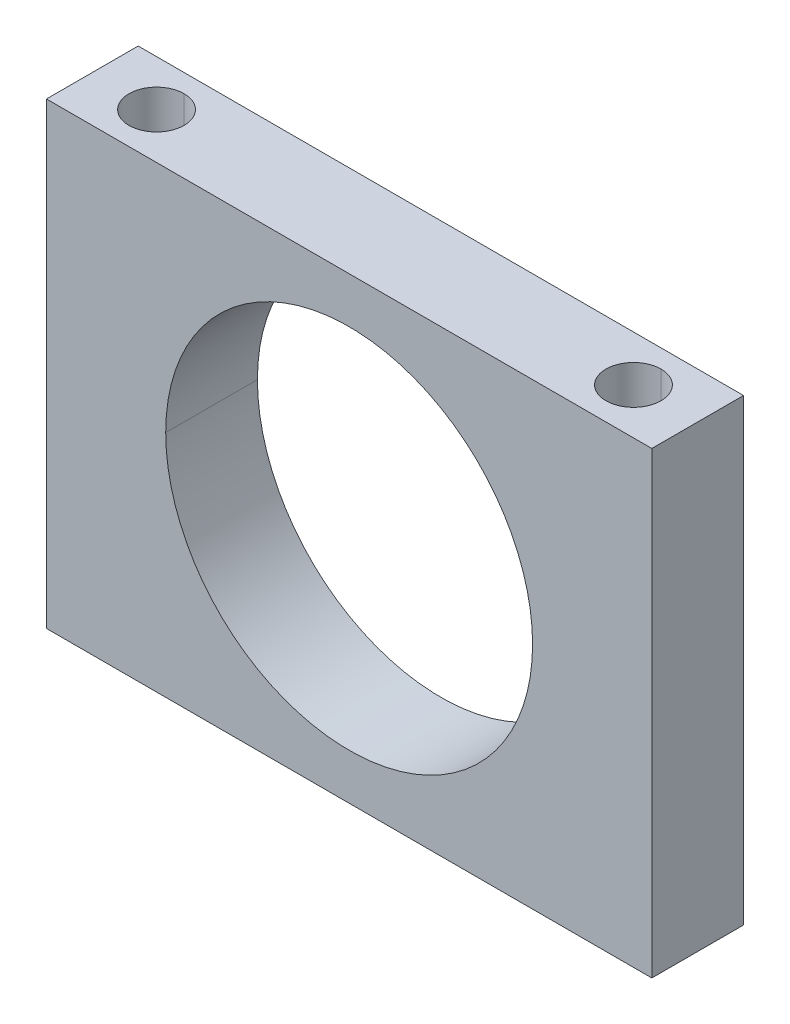
ISO-10303-21;
HEADER;
FILE_DESCRIPTION(('STEP AP214'),'2;1');
FILE_NAME('part.step','',(''),(''),'','','');
FILE_SCHEMA(('AUTOMOTIVE_DESIGN { 1 0 10303 214 1 1 1 1 }'));
ENDSEC;
DATA;
#1=APPLICATION_CONTEXT('core data for automotive mechanical design processes');
#2=APPLICATION_PROTOCOL_DEFINITION('international standard','automotive_design',2000,#1);
#3=PRODUCT_CONTEXT('',#1,'mechanical');
#4=PRODUCT('Part','Part','',(#3));
#5=PRODUCT_RELATED_PRODUCT_CATEGORY('part','',(#4));
#6=PRODUCT_DEFINITION_FORMATION('','',#4);
#7=PRODUCT_DEFINITION_CONTEXT('part definition',#1,'design');
#8=PRODUCT_DEFINITION('design','',#6,#7);
#9=PRODUCT_DEFINITION_SHAPE('','',#8);
#10=(LENGTH_UNIT() NAMED_UNIT(*) SI_UNIT(.MILLI.,.METRE.));
#11=(NAMED_UNIT(*) PLANE_ANGLE_UNIT() SI_UNIT($,.RADIAN.));
#12=(NAMED_UNIT(*) SI_UNIT($,.STERADIAN.) SOLID_ANGLE_UNIT());
#13=UNCERTAINTY_MEASURE_WITH_UNIT(LENGTH_MEASURE(1.E-05),#10,'distance_accuracy_value','');
#14=(GEOMETRIC_REPRESENTATION_CONTEXT(3) GLOBAL_UNCERTAINTY_ASSIGNED_CONTEXT((#13)) GLOBAL_UNIT_ASSIGNED_CONTEXT((#10,
#11,#12)) REPRESENTATION_CONTEXT('',''));
#15=CARTESIAN_POINT('',(0.,0.,0.));
#16=DIRECTION('',(0.,0.,1.));
#17=DIRECTION('',(1.,0.,0.));
#18=AXIS2_PLACEMENT_3D('',#15,#16,#17);
#19=CARTESIAN_POINT('',(-21.1436053074788,0.615283078611133,2.5));
#20=DIRECTION('',(0.,1.,0.));
#21=DIRECTION('',(0.,0.,1.));
#22=AXIS2_PLACEMENT_3D('',#19,#20,#21);
#23=CYLINDRICAL_SURFACE('',#22,1.5);
#24=DIRECTION('',(0.,1.,0.));
#25=VECTOR('',#24,1.);
#26=CARTESIAN_POINT('',(-21.1436053074788,0.615283078611133,1.));
#27=LINE('',#26,#25);
#28=CARTESIAN_POINT('',(-21.1436053074788,0.615283078611133,1.));
#29=VERTEX_POINT('',#28);
#30=CARTESIAN_POINT('',(-21.1436053074788,25.6152830786111,1.));
#31=VERTEX_POINT('',#30);
#32=EDGE_CURVE('E150',#29,#31,#27,.T.);
#33=ORIENTED_EDGE('',*,*,#32,.F.);
#34=CARTESIAN_POINT('',(-21.1436053074788,0.615283078611133,2.5));
#35=DIRECTION('',(0.,1.,0.));
#36=DIRECTION('',(0.,0.,1.));
#37=AXIS2_PLACEMENT_3D('',#34,#35,#36);
#38=CIRCLE('',#37,1.5);
#39=CARTESIAN_POINT('',(-21.1436053074788,0.615283078611133,4.));
#40=VERTEX_POINT('',#39);
#41=EDGE_CURVE('E27',#40,#29,#38,.T.);
#42=ORIENTED_EDGE('',*,*,#41,.F.);
#43=DIRECTION('',(0.,1.,0.));
#44=VECTOR('',#43,1.);
#45=CARTESIAN_POINT('',(-21.1436053074788,0.615283078611133,4.));
#46=LINE('',#45,#44);
#47=CARTESIAN_POINT('',(-21.1436053074788,25.6152830786111,4.));
#48=VERTEX_POINT('',#47);
#49=EDGE_CURVE('E152',#40,#48,#46,.T.);
#50=ORIENTED_EDGE('',*,*,#49,.T.);
#51=CARTESIAN_POINT('',(-21.1436053074788,25.6152830786111,2.5));
#52=DIRECTION('',(0.,-1.,0.));
#53=DIRECTION('',(0.,0.,-1.));
#54=AXIS2_PLACEMENT_3D('',#51,#52,#53);
#55=CIRCLE('',#54,1.5);
#56=EDGE_CURVE('E147',#31,#48,#55,.T.);
#57=ORIENTED_EDGE('',*,*,#56,.F.);
#58=EDGE_LOOP('',(#33,#42,#50,#57));
#59=FACE_BOUND('',#58,.T.);
#60=ADVANCED_FACE('F17',(#59),#23,.F.);
#61=CARTESIAN_POINT('',(4.85639469252124,0.615283078611133,2.5));
#62=DIRECTION('',(0.,1.,0.));
#63=DIRECTION('',(0.,0.,1.));
#64=AXIS2_PLACEMENT_3D('',#61,#62,#63);
#65=CYLINDRICAL_SURFACE('',#64,1.5);
#66=DIRECTION('',(0.,1.,0.));
#67=VECTOR('',#66,1.);
#68=CARTESIAN_POINT('',(4.85639469252124,0.615283078611133,1.));
#69=LINE('',#68,#67);
#70=CARTESIAN_POINT('',(4.85639469252124,0.615283078611133,1.));
#71=VERTEX_POINT('',#70);
#72=CARTESIAN_POINT('',(4.85639469252124,25.6152830786111,1.));
#73=VERTEX_POINT('',#72);
#74=EDGE_CURVE('E184',#71,#73,#69,.T.);
#75=ORIENTED_EDGE('',*,*,#74,.F.);
#76=CARTESIAN_POINT('',(4.85639469252124,0.615283078611133,2.5));
#77=DIRECTION('',(0.,1.,0.));
#78=DIRECTION('',(0.,0.,1.));
#79=AXIS2_PLACEMENT_3D('',#76,#77,#78);
#80=CIRCLE('',#79,1.5);
#81=CARTESIAN_POINT('',(4.85639469252124,0.615283078611133,4.));
#82=VERTEX_POINT('',#81);
#83=EDGE_CURVE('E11',#82,#71,#80,.T.);
#84=ORIENTED_EDGE('',*,*,#83,.F.);
#85=DIRECTION('',(0.,1.,0.));
#86=VECTOR('',#85,1.);
#87=CARTESIAN_POINT('',(4.85639469252124,0.615283078611133,4.));
#88=LINE('',#87,#86);
#89=CARTESIAN_POINT('',(4.85639469252124,25.6152830786111,4.));
#90=VERTEX_POINT('',#89);
#91=EDGE_CURVE('E183',#82,#90,#88,.T.);
#92=ORIENTED_EDGE('',*,*,#91,.T.);
#93=CARTESIAN_POINT('',(4.85639469252124,25.6152830786111,2.5));
#94=DIRECTION('',(0.,-1.,0.));
#95=DIRECTION('',(0.,0.,-1.));
#96=AXIS2_PLACEMENT_3D('',#93,#94,#95);
#97=CIRCLE('',#96,1.5);
#98=EDGE_CURVE('E93',#73,#90,#97,.T.);
#99=ORIENTED_EDGE('',*,*,#98,.F.);
#100=EDGE_LOOP('',(#75,#84,#92,#99));
#101=FACE_BOUND('',#100,.T.);
#102=ADVANCED_FACE('F269',(#101),#65,.F.);
#103=CARTESIAN_POINT('',(-8.14360530747876,13.1152830786111,5.));
#104=DIRECTION('',(0.,0.,-1.));
#105=DIRECTION('',(-1.,0.,0.));
#106=AXIS2_PLACEMENT_3D('',#103,#104,#105);
#107=CYLINDRICAL_SURFACE('',#106,10.);
#108=DIRECTION('',(0.,0.,-1.));
#109=VECTOR('',#108,1.);
#110=CARTESIAN_POINT('',(1.85639469252124,13.1152830786111,5.));
#111=LINE('',#110,#109);
#112=CARTESIAN_POINT('',(1.85639469252124,13.1152830786111,5.));
#113=VERTEX_POINT('',#112);
#114=CARTESIAN_POINT('',(1.85639469252124,13.1152830786111,0.));
#115=VERTEX_POINT('',#114);
#116=EDGE_CURVE('E178',#113,#115,#111,.T.);
#117=ORIENTED_EDGE('',*,*,#116,.F.);
#118=CARTESIAN_POINT('',(-8.14360530747876,13.1152830786111,5.));
#119=DIRECTION('',(0.,0.,1.));
#120=DIRECTION('',(1.,0.,0.));
#121=AXIS2_PLACEMENT_3D('',#118,#119,#120);
#122=CIRCLE('',#121,10.);
#123=CARTESIAN_POINT('',(-18.1436053074788,13.1152830786111,5.));
#124=VERTEX_POINT('',#123);
#125=EDGE_CURVE('E185',#113,#124,#122,.T.);
#126=ORIENTED_EDGE('',*,*,#125,.T.);
#127=DIRECTION('',(0.,0.,-1.));
#128=VECTOR('',#127,1.);
#129=CARTESIAN_POINT('',(-18.1436053074788,13.1152830786111,5.));
#130=LINE('',#129,#128);
#131=CARTESIAN_POINT('',(-18.1436053074788,13.1152830786111,0.));
#132=VERTEX_POINT('',#131);
#133=EDGE_CURVE('E177',#124,#132,#130,.T.);
#134=ORIENTED_EDGE('',*,*,#133,.T.);
#135=CARTESIAN_POINT('',(-8.14360530747876,13.1152830786111,0.));
#136=DIRECTION('',(0.,0.,1.));
#137=DIRECTION('',(1.,0.,0.));
#138=AXIS2_PLACEMENT_3D('',#135,#136,#137);
#139=CIRCLE('',#138,10.);
#140=EDGE_CURVE('E211',#115,#132,#139,.T.);
#141=ORIENTED_EDGE('',*,*,#140,.F.);
#142=EDGE_LOOP('',(#117,#126,#134,#141));
#143=FACE_BOUND('',#142,.T.);
#144=ADVANCED_FACE('F232',(#143),#107,.F.);
#145=CARTESIAN_POINT('',(-24.6436053074788,0.615283078611133,5.));
#146=DIRECTION('',(0.,1.,0.));
#147=DIRECTION('',(1.,0.,0.));
#148=AXIS2_PLACEMENT_3D('',#145,#146,#147);
#149=PLANE('',#148);
#150=ORIENTED_EDGE('',*,*,#83,.T.);
#151=CARTESIAN_POINT('',(4.85639469252124,0.615283078611133,2.5));
#152=DIRECTION('',(0.,1.,0.));
#153=DIRECTION('',(0.,0.,1.));
#154=AXIS2_PLACEMENT_3D('',#151,#152,#153);
#155=CIRCLE('',#154,1.5);
#156=EDGE_CURVE('E199',#71,#82,#155,.T.);
#157=ORIENTED_EDGE('',*,*,#156,.T.);
#158=EDGE_LOOP('',(#150,#157));
#159=FACE_BOUND('',#158,.T.);
#160=ORIENTED_EDGE('',*,*,#41,.T.);
#161=CARTESIAN_POINT('',(-21.1436053074788,0.615283078611133,2.5));
#162=DIRECTION('',(0.,1.,0.));
#163=DIRECTION('',(0.,0.,1.));
#164=AXIS2_PLACEMENT_3D('',#161,#162,#163);
#165=CIRCLE('',#164,1.5);
#166=EDGE_CURVE('E163',#29,#40,#165,.T.);
#167=ORIENTED_EDGE('',*,*,#166,.T.);
#168=EDGE_LOOP('',(#160,#167));
#169=FACE_BOUND('',#168,.T.);
#170=DIRECTION('',(1.,0.,0.));
#171=VECTOR('',#170,1.);
#172=CARTESIAN_POINT('',(-24.6436053074788,0.615283078611133,0.));
#173=LINE('',#172,#171);
#174=CARTESIAN_POINT('',(-24.6436053074788,0.615283078611133,0.));
#175=VERTEX_POINT('',#174);
#176=CARTESIAN_POINT('',(8.35639469252125,0.615283078611133,0.));
#177=VERTEX_POINT('',#176);
#178=EDGE_CURVE('E21',#175,#177,#173,.T.);
#179=ORIENTED_EDGE('',*,*,#178,.T.);
#180=DIRECTION('',(0.,0.,-1.));
#181=VECTOR('',#180,1.);
#182=CARTESIAN_POINT('',(8.35639469252125,0.615283078611133,5.));
#183=LINE('',#182,#181);
#184=CARTESIAN_POINT('',(8.35639469252125,0.615283078611133,5.));
#185=VERTEX_POINT('',#184);
#186=EDGE_CURVE('E210',#185,#177,#183,.T.);
#187=ORIENTED_EDGE('',*,*,#186,.F.);
#188=DIRECTION('',(1.,0.,0.));
#189=VECTOR('',#188,1.);
#190=CARTESIAN_POINT('',(-24.6436053074788,0.615283078611133,5.));
#191=LINE('',#190,#189);
#192=CARTESIAN_POINT('',(-24.6436053074788,0.615283078611133,5.));
#193=VERTEX_POINT('',#192);
#194=EDGE_CURVE('E188',#193,#185,#191,.T.);
#195=ORIENTED_EDGE('',*,*,#194,.F.);
#196=DIRECTION('',(0.,0.,-1.));
#197=VECTOR('',#196,1.);
#198=CARTESIAN_POINT('',(-24.6436053074788,0.615283078611133,5.));
#199=LINE('',#198,#197);
#200=EDGE_CURVE('E55',#193,#175,#199,.T.);
#201=ORIENTED_EDGE('',*,*,#200,.T.);
#202=EDGE_LOOP('',(#179,#187,#195,#201));
#203=FACE_BOUND('',#202,.T.);
#204=ADVANCED_FACE('F271',(#159,#169,#203),#149,.F.);
#205=CARTESIAN_POINT('',(-24.6436053074788,25.6152830786111,5.));
#206=DIRECTION('',(1.,0.,0.));
#207=DIRECTION('',(0.,1.,0.));
#208=AXIS2_PLACEMENT_3D('',#205,#206,#207);
#209=PLANE('',#208);
#210=DIRECTION('',(0.,-1.,0.));
#211=VECTOR('',#210,1.);
#212=CARTESIAN_POINT('',(-24.6436053074788,25.6152830786111,0.));
#213=LINE('',#212,#211);
#214=CARTESIAN_POINT('',(-24.6436053074788,25.6152830786111,0.));
#215=VERTEX_POINT('',#214);
#216=EDGE_CURVE('E212',#215,#175,#213,.T.);
#217=ORIENTED_EDGE('',*,*,#216,.T.);
#218=ORIENTED_EDGE('',*,*,#200,.F.);
#219=DIRECTION('',(0.,-1.,0.));
#220=VECTOR('',#219,1.);
#221=CARTESIAN_POINT('',(-24.6436053074788,25.6152830786111,5.));
#222=LINE('',#221,#220);
#223=CARTESIAN_POINT('',(-24.6436053074788,25.6152830786111,5.));
#224=VERTEX_POINT('',#223);
#225=EDGE_CURVE('E192',#224,#193,#222,.T.);
#226=ORIENTED_EDGE('',*,*,#225,.F.);
#227=DIRECTION('',(0.,0.,-1.));
#228=VECTOR('',#227,1.);
#229=CARTESIAN_POINT('',(-24.6436053074788,25.6152830786111,5.));
#230=LINE('',#229,#228);
#231=EDGE_CURVE('E41',#224,#215,#230,.T.);
#232=ORIENTED_EDGE('',*,*,#231,.T.);
#233=EDGE_LOOP('',(#217,#218,#226,#232));
#234=FACE_BOUND('',#233,.T.);
#235=ADVANCED_FACE('F274',(#234),#209,.F.);
#236=CARTESIAN_POINT('',(-24.6436053074788,25.6152830786111,5.));
#237=DIRECTION('',(0.,-1.,0.));
#238=DIRECTION('',(0.,0.,-1.));
#239=AXIS2_PLACEMENT_3D('',#236,#237,#238);
#240=PLANE('',#239);
#241=CARTESIAN_POINT('',(4.85639469252124,25.6152830786111,2.5));
#242=DIRECTION('',(0.,-1.,0.));
#243=DIRECTION('',(0.,0.,-1.));
#244=AXIS2_PLACEMENT_3D('',#241,#242,#243);
#245=CIRCLE('',#244,1.5);
#246=EDGE_CURVE('E180',#90,#73,#245,.T.);
#247=ORIENTED_EDGE('',*,*,#246,.T.);
#248=ORIENTED_EDGE('',*,*,#98,.T.);
#249=EDGE_LOOP('',(#247,#248));
#250=FACE_BOUND('',#249,.T.);
#251=CARTESIAN_POINT('',(-21.1436053074788,25.6152830786111,2.5));
#252=DIRECTION('',(0.,-1.,0.));
#253=DIRECTION('',(0.,0.,-1.));
#254=AXIS2_PLACEMENT_3D('',#251,#252,#253);
#255=CIRCLE('',#254,1.5);
#256=EDGE_CURVE('E157',#48,#31,#255,.T.);
#257=ORIENTED_EDGE('',*,*,#256,.T.);
#258=ORIENTED_EDGE('',*,*,#56,.T.);
#259=EDGE_LOOP('',(#257,#258));
#260=FACE_BOUND('',#259,.T.);
#261=DIRECTION('',(-1.,0.,0.));
#262=VECTOR('',#261,1.);
#263=CARTESIAN_POINT('',(-24.6436053074788,25.6152830786111,0.));
#264=LINE('',#263,#262);
#265=CARTESIAN_POINT('',(8.35639469252124,25.6152830786111,0.));
#266=VERTEX_POINT('',#265);
#267=EDGE_CURVE('E215',#266,#215,#264,.T.);
#268=ORIENTED_EDGE('',*,*,#267,.T.);
#269=ORIENTED_EDGE('',*,*,#231,.F.);
#270=DIRECTION('',(-1.,0.,0.));
#271=VECTOR('',#270,1.);
#272=CARTESIAN_POINT('',(-24.6436053074788,25.6152830786111,5.));
#273=LINE('',#272,#271);
#274=CARTESIAN_POINT('',(8.35639469252124,25.6152830786111,5.));
#275=VERTEX_POINT('',#274);
#276=EDGE_CURVE('E195',#275,#224,#273,.T.);
#277=ORIENTED_EDGE('',*,*,#276,.F.);
#278=DIRECTION('',(0.,0.,-1.));
#279=VECTOR('',#278,1.);
#280=CARTESIAN_POINT('',(8.35639469252124,25.6152830786111,5.));
#281=LINE('',#280,#279);
#282=EDGE_CURVE('E125',#275,#266,#281,.T.);
#283=ORIENTED_EDGE('',*,*,#282,.T.);
#284=EDGE_LOOP('',(#268,#269,#277,#283));
#285=FACE_BOUND('',#284,.T.);
#286=ADVANCED_FACE('F19',(#250,#260,#285),#240,.F.);
#287=CARTESIAN_POINT('',(8.35639469252124,25.6152830786111,5.));
#288=DIRECTION('',(-1.,0.,0.));
#289=DIRECTION('',(0.,1.,0.));
#290=AXIS2_PLACEMENT_3D('',#287,#288,#289);
#291=PLANE('',#290);
#292=DIRECTION('',(0.,1.,0.));
#293=VECTOR('',#292,1.);
#294=CARTESIAN_POINT('',(8.35639469252124,25.6152830786111,0.));
#295=LINE('',#294,#293);
#296=EDGE_CURVE('E187',#177,#266,#295,.T.);
#297=ORIENTED_EDGE('',*,*,#296,.T.);
#298=ORIENTED_EDGE('',*,*,#282,.F.);
#299=DIRECTION('',(0.,1.,0.));
#300=VECTOR('',#299,1.);
#301=CARTESIAN_POINT('',(8.35639469252124,25.6152830786111,5.));
#302=LINE('',#301,#300);
#303=EDGE_CURVE('E220',#185,#275,#302,.T.);
#304=ORIENTED_EDGE('',*,*,#303,.F.);
#305=ORIENTED_EDGE('',*,*,#186,.T.);
#306=EDGE_LOOP('',(#297,#298,#304,#305));
#307=FACE_BOUND('',#306,.T.);
#308=ADVANCED_FACE('F280',(#307),#291,.F.);
#309=CARTESIAN_POINT('',(0.,0.,0.));
#310=DIRECTION('',(0.,0.,1.));
#311=DIRECTION('',(1.,0.,0.));
#312=AXIS2_PLACEMENT_3D('',#309,#310,#311);
#313=PLANE('',#312);
#314=CARTESIAN_POINT('',(-8.14360530747876,13.1152830786111,0.));
#315=DIRECTION('',(0.,0.,1.));
#316=DIRECTION('',(1.,0.,0.));
#317=AXIS2_PLACEMENT_3D('',#314,#315,#316);
#318=CIRCLE('',#317,10.);
#319=EDGE_CURVE('E175',#132,#115,#318,.T.);
#320=ORIENTED_EDGE('',*,*,#319,.T.);
#321=ORIENTED_EDGE('',*,*,#140,.T.);
#322=EDGE_LOOP('',(#320,#321));
#323=FACE_BOUND('',#322,.T.);
#324=ORIENTED_EDGE('',*,*,#296,.F.);
#325=ORIENTED_EDGE('',*,*,#178,.F.);
#326=ORIENTED_EDGE('',*,*,#216,.F.);
#327=ORIENTED_EDGE('',*,*,#267,.F.);
#328=EDGE_LOOP('',(#324,#325,#326,#327));
#329=FACE_BOUND('',#328,.T.);
#330=ADVANCED_FACE('F238',(#323,#329),#313,.F.);
#331=CARTESIAN_POINT('',(0.,0.,5.));
#332=DIRECTION('',(0.,0.,1.));
#333=DIRECTION('',(1.,0.,0.));
#334=AXIS2_PLACEMENT_3D('',#331,#332,#333);
#335=PLANE('',#334);
#336=CARTESIAN_POINT('',(-8.14360530747876,13.1152830786111,5.));
#337=DIRECTION('',(0.,0.,1.));
#338=DIRECTION('',(1.,0.,0.));
#339=AXIS2_PLACEMENT_3D('',#336,#337,#338);
#340=CIRCLE('',#339,10.);
#341=EDGE_CURVE('E216',#124,#113,#340,.T.);
#342=ORIENTED_EDGE('',*,*,#341,.F.);
#343=ORIENTED_EDGE('',*,*,#125,.F.);
#344=EDGE_LOOP('',(#342,#343));
#345=FACE_BOUND('',#344,.T.);
#346=ORIENTED_EDGE('',*,*,#303,.T.);
#347=ORIENTED_EDGE('',*,*,#276,.T.);
#348=ORIENTED_EDGE('',*,*,#225,.T.);
#349=ORIENTED_EDGE('',*,*,#194,.T.);
#350=EDGE_LOOP('',(#346,#347,#348,#349));
#351=FACE_BOUND('',#350,.T.);
#352=ADVANCED_FACE('F282',(#345,#351),#335,.T.);
#353=CARTESIAN_POINT('',(-8.14360530747876,13.1152830786111,5.));
#354=DIRECTION('',(0.,0.,-1.));
#355=DIRECTION('',(-1.,0.,0.));
#356=AXIS2_PLACEMENT_3D('',#353,#354,#355);
#357=CYLINDRICAL_SURFACE('',#356,10.);
#358=ORIENTED_EDGE('',*,*,#341,.T.);
#359=ORIENTED_EDGE('',*,*,#116,.T.);
#360=ORIENTED_EDGE('',*,*,#319,.F.);
#361=ORIENTED_EDGE('',*,*,#133,.F.);
#362=EDGE_LOOP('',(#358,#359,#360,#361));
#363=FACE_BOUND('',#362,.T.);
#364=ADVANCED_FACE('F236',(#363),#357,.F.);
#365=CARTESIAN_POINT('',(4.85639469252124,0.615283078611133,2.5));
#366=DIRECTION('',(0.,1.,0.));
#367=DIRECTION('',(0.,0.,1.));
#368=AXIS2_PLACEMENT_3D('',#365,#366,#367);
#369=CYLINDRICAL_SURFACE('',#368,1.5);
#370=ORIENTED_EDGE('',*,*,#156,.F.);
#371=ORIENTED_EDGE('',*,*,#74,.T.);
#372=ORIENTED_EDGE('',*,*,#246,.F.);
#373=ORIENTED_EDGE('',*,*,#91,.F.);
#374=EDGE_LOOP('',(#370,#371,#372,#373));
#375=FACE_BOUND('',#374,.T.);
#376=ADVANCED_FACE('F267',(#375),#369,.F.);
#377=CARTESIAN_POINT('',(-21.1436053074788,0.615283078611133,2.5));
#378=DIRECTION('',(0.,1.,0.));
#379=DIRECTION('',(0.,0.,1.));
#380=AXIS2_PLACEMENT_3D('',#377,#378,#379);
#381=CYLINDRICAL_SURFACE('',#380,1.5);
#382=ORIENTED_EDGE('',*,*,#166,.F.);
#383=ORIENTED_EDGE('',*,*,#32,.T.);
#384=ORIENTED_EDGE('',*,*,#256,.F.);
#385=ORIENTED_EDGE('',*,*,#49,.F.);
#386=EDGE_LOOP('',(#382,#383,#384,#385));
#387=FACE_BOUND('',#386,.T.);
#388=ADVANCED_FACE('F161',(#387),#381,.F.);
#389=CLOSED_SHELL('',(#60,#102,#144,#204,#235,#286,#308,#330,#352,#364,#376,#388));
#390=MANIFOLD_SOLID_BREP('B1',#389);
#391=ADVANCED_BREP_SHAPE_REPRESENTATION('',(#18,#390),#14);
#392=SHAPE_DEFINITION_REPRESENTATION(#9,#391);
ENDSEC;
END-ISO-10303-21;
